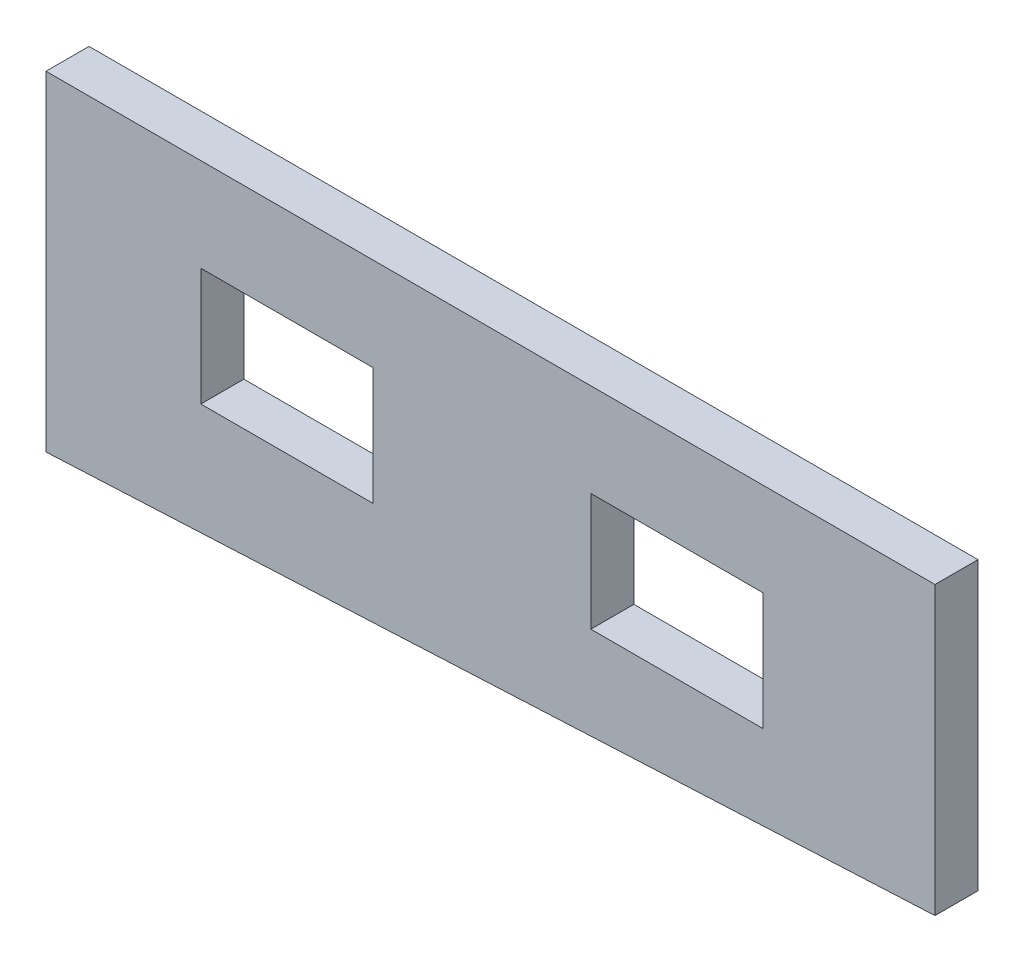
ISO-10303-21;
HEADER;
FILE_DESCRIPTION(('STEP AP214'),'2;1');
FILE_NAME('part.step','',(''),(''),'','','');
FILE_SCHEMA(('AUTOMOTIVE_DESIGN { 1 0 10303 214 1 1 1 1 }'));
ENDSEC;
DATA;
#1=APPLICATION_CONTEXT('core data for automotive mechanical design processes');
#2=APPLICATION_PROTOCOL_DEFINITION('international standard','automotive_design',2000,#1);
#3=PRODUCT_CONTEXT('',#1,'mechanical');
#4=PRODUCT('Part','Part','',(#3));
#5=PRODUCT_RELATED_PRODUCT_CATEGORY('part','',(#4));
#6=PRODUCT_DEFINITION_FORMATION('','',#4);
#7=PRODUCT_DEFINITION_CONTEXT('part definition',#1,'design');
#8=PRODUCT_DEFINITION('design','',#6,#7);
#9=PRODUCT_DEFINITION_SHAPE('','',#8);
#10=(LENGTH_UNIT() NAMED_UNIT(*) SI_UNIT(.MILLI.,.METRE.));
#11=(NAMED_UNIT(*) PLANE_ANGLE_UNIT() SI_UNIT($,.RADIAN.));
#12=(NAMED_UNIT(*) SI_UNIT($,.STERADIAN.) SOLID_ANGLE_UNIT());
#13=UNCERTAINTY_MEASURE_WITH_UNIT(LENGTH_MEASURE(1.E-05),#10,'distance_accuracy_value','');
#14=(GEOMETRIC_REPRESENTATION_CONTEXT(3) GLOBAL_UNCERTAINTY_ASSIGNED_CONTEXT((#13)) GLOBAL_UNIT_ASSIGNED_CONTEXT((#10,
#11,#12)) REPRESENTATION_CONTEXT('',''));
#15=CARTESIAN_POINT('',(0.,0.,0.));
#16=DIRECTION('',(0.,0.,1.));
#17=DIRECTION('',(1.,0.,0.));
#18=AXIS2_PLACEMENT_3D('',#15,#16,#17);
#19=CARTESIAN_POINT('',(6200.,300.,300.));
#20=DIRECTION('',(-0.0483305514233226,0.998831396082,0.));
#21=DIRECTION('',(-0.998831396082,-0.0483305514233226,0.));
#22=AXIS2_PLACEMENT_3D('',#19,#20,#21);
#23=PLANE('',#22);
#24=DIRECTION('',(0.998831396082,0.0483305514233226,0.));
#25=VECTOR('',#24,1.);
#26=CARTESIAN_POINT('',(6200.,300.,0.));
#27=LINE('',#26,#25);
#28=CARTESIAN_POINT('',(0.,0.,0.));
#29=VERTEX_POINT('',#28);
#30=CARTESIAN_POINT('',(6200.,300.,0.));
#31=VERTEX_POINT('',#30);
#32=EDGE_CURVE('E276',#29,#31,#27,.T.);
#33=ORIENTED_EDGE('',*,*,#32,.T.);
#34=DIRECTION('',(0.,0.,-1.));
#35=VECTOR('',#34,1.);
#36=CARTESIAN_POINT('',(6200.,300.,300.));
#37=LINE('',#36,#35);
#38=CARTESIAN_POINT('',(6200.,300.,300.));
#39=VERTEX_POINT('',#38);
#40=EDGE_CURVE('E12',#39,#31,#37,.T.);
#41=ORIENTED_EDGE('',*,*,#40,.F.);
#42=DIRECTION('',(0.998831396082,0.0483305514233226,0.));
#43=VECTOR('',#42,1.);
#44=CARTESIAN_POINT('',(6200.,300.,300.));
#45=LINE('',#44,#43);
#46=CARTESIAN_POINT('',(0.,0.,300.));
#47=VERTEX_POINT('',#46);
#48=EDGE_CURVE('E287',#47,#39,#45,.T.);
#49=ORIENTED_EDGE('',*,*,#48,.F.);
#50=DIRECTION('',(0.,0.,-1.));
#51=VECTOR('',#50,1.);
#52=CARTESIAN_POINT('',(0.,0.,300.));
#53=LINE('',#52,#51);
#54=EDGE_CURVE('E305',#47,#29,#53,.T.);
#55=ORIENTED_EDGE('',*,*,#54,.T.);
#56=EDGE_LOOP('',(#33,#41,#49,#55));
#57=FACE_BOUND('',#56,.T.);
#58=ADVANCED_FACE('F45',(#57),#23,.F.);
#59=CARTESIAN_POINT('',(6200.,2300.,300.));
#60=DIRECTION('',(-1.,0.,0.));
#61=DIRECTION('',(0.,-1.,0.));
#62=AXIS2_PLACEMENT_3D('',#59,#60,#61);
#63=PLANE('',#62);
#64=DIRECTION('',(0.,1.,0.));
#65=VECTOR('',#64,1.);
#66=CARTESIAN_POINT('',(6200.,2300.,0.));
#67=LINE('',#66,#65);
#68=CARTESIAN_POINT('',(6200.,2300.,0.));
#69=VERTEX_POINT('',#68);
#70=EDGE_CURVE('E329',#31,#69,#67,.T.);
#71=ORIENTED_EDGE('',*,*,#70,.T.);
#72=DIRECTION('',(0.,0.,-1.));
#73=VECTOR('',#72,1.);
#74=CARTESIAN_POINT('',(6200.,2300.,300.));
#75=LINE('',#74,#73);
#76=CARTESIAN_POINT('',(6200.,2300.,300.));
#77=VERTEX_POINT('',#76);
#78=EDGE_CURVE('E55',#77,#69,#75,.T.);
#79=ORIENTED_EDGE('',*,*,#78,.F.);
#80=DIRECTION('',(0.,1.,0.));
#81=VECTOR('',#80,1.);
#82=CARTESIAN_POINT('',(6200.,2300.,300.));
#83=LINE('',#82,#81);
#84=EDGE_CURVE('E292',#39,#77,#83,.T.);
#85=ORIENTED_EDGE('',*,*,#84,.F.);
#86=ORIENTED_EDGE('',*,*,#40,.T.);
#87=EDGE_LOOP('',(#71,#79,#85,#86));
#88=FACE_BOUND('',#87,.T.);
#89=ADVANCED_FACE('F355',(#88),#63,.F.);
#90=CARTESIAN_POINT('',(0.,2300.,300.));
#91=DIRECTION('',(0.,-1.,0.));
#92=DIRECTION('',(0.,0.,-1.));
#93=AXIS2_PLACEMENT_3D('',#90,#91,#92);
#94=PLANE('',#93);
#95=DIRECTION('',(-1.,0.,0.));
#96=VECTOR('',#95,1.);
#97=CARTESIAN_POINT('',(0.,2300.,0.));
#98=LINE('',#97,#96);
#99=CARTESIAN_POINT('',(0.,2300.,0.));
#100=VERTEX_POINT('',#99);
#101=EDGE_CURVE('E332',#69,#100,#98,.T.);
#102=ORIENTED_EDGE('',*,*,#101,.T.);
#103=DIRECTION('',(0.,0.,-1.));
#104=VECTOR('',#103,1.);
#105=CARTESIAN_POINT('',(0.,2300.,300.));
#106=LINE('',#105,#104);
#107=CARTESIAN_POINT('',(0.,2300.,300.));
#108=VERTEX_POINT('',#107);
#109=EDGE_CURVE('E310',#108,#100,#106,.T.);
#110=ORIENTED_EDGE('',*,*,#109,.F.);
#111=DIRECTION('',(-1.,0.,0.));
#112=VECTOR('',#111,1.);
#113=CARTESIAN_POINT('',(0.,2300.,300.));
#114=LINE('',#113,#112);
#115=EDGE_CURVE('E319',#77,#108,#114,.T.);
#116=ORIENTED_EDGE('',*,*,#115,.F.);
#117=ORIENTED_EDGE('',*,*,#78,.T.);
#118=EDGE_LOOP('',(#102,#110,#116,#117));
#119=FACE_BOUND('',#118,.T.);
#120=ADVANCED_FACE('F360',(#119),#94,.F.);
#121=CARTESIAN_POINT('',(0.,0.,300.));
#122=DIRECTION('',(1.,0.,0.));
#123=DIRECTION('',(0.,0.,-1.));
#124=AXIS2_PLACEMENT_3D('',#121,#122,#123);
#125=PLANE('',#124);
#126=DIRECTION('',(0.,-1.,0.));
#127=VECTOR('',#126,1.);
#128=CARTESIAN_POINT('',(0.,0.,0.));
#129=LINE('',#128,#127);
#130=EDGE_CURVE('E293',#100,#29,#129,.T.);
#131=ORIENTED_EDGE('',*,*,#130,.T.);
#132=ORIENTED_EDGE('',*,*,#54,.F.);
#133=DIRECTION('',(0.,-1.,0.));
#134=VECTOR('',#133,1.);
#135=CARTESIAN_POINT('',(0.,0.,300.));
#136=LINE('',#135,#134);
#137=EDGE_CURVE('E311',#108,#47,#136,.T.);
#138=ORIENTED_EDGE('',*,*,#137,.F.);
#139=ORIENTED_EDGE('',*,*,#109,.T.);
#140=EDGE_LOOP('',(#131,#132,#138,#139));
#141=FACE_BOUND('',#140,.T.);
#142=ADVANCED_FACE('F346',(#141),#125,.F.);
#143=CARTESIAN_POINT('',(0.,0.,300.));
#144=DIRECTION('',(0.,0.,-1.));
#145=DIRECTION('',(-1.,0.,0.));
#146=AXIS2_PLACEMENT_3D('',#143,#144,#145);
#147=PLANE('',#146);
#148=DIRECTION('',(1.,0.,0.));
#149=VECTOR('',#148,1.);
#150=CARTESIAN_POINT('',(3800.,830.,300.));
#151=LINE('',#150,#149);
#152=CARTESIAN_POINT('',(3800.,830.,300.));
#153=VERTEX_POINT('',#152);
#154=CARTESIAN_POINT('',(5000.,830.,300.));
#155=VERTEX_POINT('',#154);
#156=EDGE_CURVE('E208',#153,#155,#151,.T.);
#157=ORIENTED_EDGE('',*,*,#156,.F.);
#158=DIRECTION('',(0.,-1.,0.));
#159=VECTOR('',#158,1.);
#160=CARTESIAN_POINT('',(3800.,1650.,300.));
#161=LINE('',#160,#159);
#162=CARTESIAN_POINT('',(3800.,1650.,300.));
#163=VERTEX_POINT('',#162);
#164=EDGE_CURVE('E65',#163,#153,#161,.T.);
#165=ORIENTED_EDGE('',*,*,#164,.F.);
#166=DIRECTION('',(-1.,0.,0.));
#167=VECTOR('',#166,1.);
#168=CARTESIAN_POINT('',(3800.,1650.,300.));
#169=LINE('',#168,#167);
#170=CARTESIAN_POINT('',(5000.,1650.,300.));
#171=VERTEX_POINT('',#170);
#172=EDGE_CURVE('E181',#171,#163,#169,.T.);
#173=ORIENTED_EDGE('',*,*,#172,.F.);
#174=DIRECTION('',(0.,1.,0.));
#175=VECTOR('',#174,1.);
#176=CARTESIAN_POINT('',(5000.,1650.,300.));
#177=LINE('',#176,#175);
#178=EDGE_CURVE('E186',#155,#171,#177,.T.);
#179=ORIENTED_EDGE('',*,*,#178,.F.);
#180=EDGE_LOOP('',(#157,#165,#173,#179));
#181=FACE_BOUND('',#180,.T.);
#182=DIRECTION('',(1.,0.,0.));
#183=VECTOR('',#182,1.);
#184=CARTESIAN_POINT('',(1080.,830.,300.));
#185=LINE('',#184,#183);
#186=CARTESIAN_POINT('',(1080.,830.,300.));
#187=VERTEX_POINT('',#186);
#188=CARTESIAN_POINT('',(2280.,830.,300.));
#189=VERTEX_POINT('',#188);
#190=EDGE_CURVE('E262',#187,#189,#185,.T.);
#191=ORIENTED_EDGE('',*,*,#190,.F.);
#192=DIRECTION('',(0.,-1.,0.));
#193=VECTOR('',#192,1.);
#194=CARTESIAN_POINT('',(1080.,1650.,300.));
#195=LINE('',#194,#193);
#196=CARTESIAN_POINT('',(1080.,1650.,300.));
#197=VERTEX_POINT('',#196);
#198=EDGE_CURVE('E224',#197,#187,#195,.T.);
#199=ORIENTED_EDGE('',*,*,#198,.F.);
#200=DIRECTION('',(-1.,0.,0.));
#201=VECTOR('',#200,1.);
#202=CARTESIAN_POINT('',(1080.,1650.,300.));
#203=LINE('',#202,#201);
#204=CARTESIAN_POINT('',(2280.,1650.,300.));
#205=VERTEX_POINT('',#204);
#206=EDGE_CURVE('E241',#205,#197,#203,.T.);
#207=ORIENTED_EDGE('',*,*,#206,.F.);
#208=DIRECTION('',(0.,1.,0.));
#209=VECTOR('',#208,1.);
#210=CARTESIAN_POINT('',(2280.,1650.,300.));
#211=LINE('',#210,#209);
#212=EDGE_CURVE('E270',#189,#205,#211,.T.);
#213=ORIENTED_EDGE('',*,*,#212,.F.);
#214=EDGE_LOOP('',(#191,#199,#207,#213));
#215=FACE_BOUND('',#214,.T.);
#216=ORIENTED_EDGE('',*,*,#48,.T.);
#217=ORIENTED_EDGE('',*,*,#84,.T.);
#218=ORIENTED_EDGE('',*,*,#115,.T.);
#219=ORIENTED_EDGE('',*,*,#137,.T.);
#220=EDGE_LOOP('',(#216,#217,#218,#219));
#221=FACE_BOUND('',#220,.T.);
#222=ADVANCED_FACE('F359',(#181,#215,#221),#147,.F.);
#223=CARTESIAN_POINT('',(0.,0.,0.));
#224=DIRECTION('',(0.,0.,-1.));
#225=DIRECTION('',(-1.,0.,0.));
#226=AXIS2_PLACEMENT_3D('',#223,#224,#225);
#227=PLANE('',#226);
#228=DIRECTION('',(0.,-1.,0.));
#229=VECTOR('',#228,1.);
#230=CARTESIAN_POINT('',(3800.,1650.,0.));
#231=LINE('',#230,#229);
#232=CARTESIAN_POINT('',(3800.,1650.,0.));
#233=VERTEX_POINT('',#232);
#234=CARTESIAN_POINT('',(3800.,830.,0.));
#235=VERTEX_POINT('',#234);
#236=EDGE_CURVE('E162',#233,#235,#231,.T.);
#237=ORIENTED_EDGE('',*,*,#236,.T.);
#238=DIRECTION('',(1.,0.,0.));
#239=VECTOR('',#238,1.);
#240=CARTESIAN_POINT('',(3800.,830.,0.));
#241=LINE('',#240,#239);
#242=CARTESIAN_POINT('',(5000.,830.,0.));
#243=VERTEX_POINT('',#242);
#244=EDGE_CURVE('E172',#235,#243,#241,.T.);
#245=ORIENTED_EDGE('',*,*,#244,.T.);
#246=DIRECTION('',(0.,1.,0.));
#247=VECTOR('',#246,1.);
#248=CARTESIAN_POINT('',(5000.,1650.,0.));
#249=LINE('',#248,#247);
#250=CARTESIAN_POINT('',(5000.,1650.,0.));
#251=VERTEX_POINT('',#250);
#252=EDGE_CURVE('E76',#243,#251,#249,.T.);
#253=ORIENTED_EDGE('',*,*,#252,.T.);
#254=DIRECTION('',(-1.,0.,0.));
#255=VECTOR('',#254,1.);
#256=CARTESIAN_POINT('',(3800.,1650.,0.));
#257=LINE('',#256,#255);
#258=EDGE_CURVE('E169',#251,#233,#257,.T.);
#259=ORIENTED_EDGE('',*,*,#258,.T.);
#260=EDGE_LOOP('',(#237,#245,#253,#259));
#261=FACE_BOUND('',#260,.T.);
#262=DIRECTION('',(0.,-1.,0.));
#263=VECTOR('',#262,1.);
#264=CARTESIAN_POINT('',(1080.,1650.,0.));
#265=LINE('',#264,#263);
#266=CARTESIAN_POINT('',(1080.,1650.,0.));
#267=VERTEX_POINT('',#266);
#268=CARTESIAN_POINT('',(1080.,830.,0.));
#269=VERTEX_POINT('',#268);
#270=EDGE_CURVE('E235',#267,#269,#265,.T.);
#271=ORIENTED_EDGE('',*,*,#270,.T.);
#272=DIRECTION('',(1.,0.,0.));
#273=VECTOR('',#272,1.);
#274=CARTESIAN_POINT('',(1080.,830.,0.));
#275=LINE('',#274,#273);
#276=CARTESIAN_POINT('',(2280.,830.,0.));
#277=VERTEX_POINT('',#276);
#278=EDGE_CURVE('E240',#269,#277,#275,.T.);
#279=ORIENTED_EDGE('',*,*,#278,.T.);
#280=DIRECTION('',(0.,1.,0.));
#281=VECTOR('',#280,1.);
#282=CARTESIAN_POINT('',(2280.,1650.,0.));
#283=LINE('',#282,#281);
#284=CARTESIAN_POINT('',(2280.,1650.,0.));
#285=VERTEX_POINT('',#284);
#286=EDGE_CURVE('E249',#277,#285,#283,.T.);
#287=ORIENTED_EDGE('',*,*,#286,.T.);
#288=DIRECTION('',(-1.,0.,0.));
#289=VECTOR('',#288,1.);
#290=CARTESIAN_POINT('',(1080.,1650.,0.));
#291=LINE('',#290,#289);
#292=EDGE_CURVE('E253',#285,#267,#291,.T.);
#293=ORIENTED_EDGE('',*,*,#292,.T.);
#294=EDGE_LOOP('',(#271,#279,#287,#293));
#295=FACE_BOUND('',#294,.T.);
#296=ORIENTED_EDGE('',*,*,#32,.F.);
#297=ORIENTED_EDGE('',*,*,#130,.F.);
#298=ORIENTED_EDGE('',*,*,#101,.F.);
#299=ORIENTED_EDGE('',*,*,#70,.F.);
#300=EDGE_LOOP('',(#296,#297,#298,#299));
#301=FACE_BOUND('',#300,.T.);
#302=ADVANCED_FACE('F177',(#261,#295,#301),#227,.T.);
#303=CARTESIAN_POINT('',(1080.,1650.,0.));
#304=DIRECTION('',(-1.,0.,0.));
#305=DIRECTION('',(0.,-1.,0.));
#306=AXIS2_PLACEMENT_3D('',#303,#304,#305);
#307=PLANE('',#306);
#308=ORIENTED_EDGE('',*,*,#198,.T.);
#309=DIRECTION('',(0.,0.,1.));
#310=VECTOR('',#309,1.);
#311=CARTESIAN_POINT('',(1080.,830.,0.));
#312=LINE('',#311,#310);
#313=EDGE_CURVE('E258',#269,#187,#312,.T.);
#314=ORIENTED_EDGE('',*,*,#313,.F.);
#315=ORIENTED_EDGE('',*,*,#270,.F.);
#316=DIRECTION('',(0.,0.,1.));
#317=VECTOR('',#316,1.);
#318=CARTESIAN_POINT('',(1080.,1650.,0.));
#319=LINE('',#318,#317);
#320=EDGE_CURVE('E272',#267,#197,#319,.T.);
#321=ORIENTED_EDGE('',*,*,#320,.T.);
#322=EDGE_LOOP('',(#308,#314,#315,#321));
#323=FACE_BOUND('',#322,.T.);
#324=ADVANCED_FACE('F398',(#323),#307,.F.);
#325=CARTESIAN_POINT('',(1080.,1650.,0.));
#326=DIRECTION('',(0.,1.,0.));
#327=DIRECTION('',(0.,0.,1.));
#328=AXIS2_PLACEMENT_3D('',#325,#326,#327);
#329=PLANE('',#328);
#330=ORIENTED_EDGE('',*,*,#206,.T.);
#331=ORIENTED_EDGE('',*,*,#320,.F.);
#332=ORIENTED_EDGE('',*,*,#292,.F.);
#333=DIRECTION('',(0.,0.,1.));
#334=VECTOR('',#333,1.);
#335=CARTESIAN_POINT('',(2280.,1650.,0.));
#336=LINE('',#335,#334);
#337=EDGE_CURVE('E277',#285,#205,#336,.T.);
#338=ORIENTED_EDGE('',*,*,#337,.T.);
#339=EDGE_LOOP('',(#330,#331,#332,#338));
#340=FACE_BOUND('',#339,.T.);
#341=ADVANCED_FACE('F406',(#340),#329,.F.);
#342=CARTESIAN_POINT('',(2280.,1650.,0.));
#343=DIRECTION('',(1.,0.,0.));
#344=DIRECTION('',(0.,1.,0.));
#345=AXIS2_PLACEMENT_3D('',#342,#343,#344);
#346=PLANE('',#345);
#347=ORIENTED_EDGE('',*,*,#212,.T.);
#348=ORIENTED_EDGE('',*,*,#337,.F.);
#349=ORIENTED_EDGE('',*,*,#286,.F.);
#350=DIRECTION('',(0.,0.,1.));
#351=VECTOR('',#350,1.);
#352=CARTESIAN_POINT('',(2280.,830.,0.));
#353=LINE('',#352,#351);
#354=EDGE_CURVE('E285',#277,#189,#353,.T.);
#355=ORIENTED_EDGE('',*,*,#354,.T.);
#356=EDGE_LOOP('',(#347,#348,#349,#355));
#357=FACE_BOUND('',#356,.T.);
#358=ADVANCED_FACE('F415',(#357),#346,.F.);
#359=CARTESIAN_POINT('',(1080.,830.,0.));
#360=DIRECTION('',(0.,-1.,0.));
#361=DIRECTION('',(0.,0.,-1.));
#362=AXIS2_PLACEMENT_3D('',#359,#360,#361);
#363=PLANE('',#362);
#364=ORIENTED_EDGE('',*,*,#190,.T.);
#365=ORIENTED_EDGE('',*,*,#354,.F.);
#366=ORIENTED_EDGE('',*,*,#278,.F.);
#367=ORIENTED_EDGE('',*,*,#313,.T.);
#368=EDGE_LOOP('',(#364,#365,#366,#367));
#369=FACE_BOUND('',#368,.T.);
#370=ADVANCED_FACE('F424',(#369),#363,.F.);
#371=CARTESIAN_POINT('',(3800.,1650.,0.));
#372=DIRECTION('',(-1.,0.,0.));
#373=DIRECTION('',(0.,0.,1.));
#374=AXIS2_PLACEMENT_3D('',#371,#372,#373);
#375=PLANE('',#374);
#376=ORIENTED_EDGE('',*,*,#164,.T.);
#377=DIRECTION('',(0.,0.,1.));
#378=VECTOR('',#377,1.);
#379=CARTESIAN_POINT('',(3800.,830.,0.));
#380=LINE('',#379,#378);
#381=EDGE_CURVE('E158',#235,#153,#380,.T.);
#382=ORIENTED_EDGE('',*,*,#381,.F.);
#383=ORIENTED_EDGE('',*,*,#236,.F.);
#384=DIRECTION('',(0.,0.,1.));
#385=VECTOR('',#384,1.);
#386=CARTESIAN_POINT('',(3800.,1650.,0.));
#387=LINE('',#386,#385);
#388=EDGE_CURVE('E220',#233,#163,#387,.T.);
#389=ORIENTED_EDGE('',*,*,#388,.T.);
#390=EDGE_LOOP('',(#376,#382,#383,#389));
#391=FACE_BOUND('',#390,.T.);
#392=ADVANCED_FACE('F160',(#391),#375,.F.);
#393=CARTESIAN_POINT('',(3800.,1650.,0.));
#394=DIRECTION('',(0.,1.,0.));
#395=DIRECTION('',(0.,0.,1.));
#396=AXIS2_PLACEMENT_3D('',#393,#394,#395);
#397=PLANE('',#396);
#398=ORIENTED_EDGE('',*,*,#172,.T.);
#399=ORIENTED_EDGE('',*,*,#388,.F.);
#400=ORIENTED_EDGE('',*,*,#258,.F.);
#401=DIRECTION('',(0.,0.,1.));
#402=VECTOR('',#401,1.);
#403=CARTESIAN_POINT('',(5000.,1650.,0.));
#404=LINE('',#403,#402);
#405=EDGE_CURVE('E225',#251,#171,#404,.T.);
#406=ORIENTED_EDGE('',*,*,#405,.T.);
#407=EDGE_LOOP('',(#398,#399,#400,#406));
#408=FACE_BOUND('',#407,.T.);
#409=ADVANCED_FACE('F441',(#408),#397,.F.);
#410=CARTESIAN_POINT('',(5000.,1650.,0.));
#411=DIRECTION('',(1.,0.,0.));
#412=DIRECTION('',(0.,1.,0.));
#413=AXIS2_PLACEMENT_3D('',#410,#411,#412);
#414=PLANE('',#413);
#415=ORIENTED_EDGE('',*,*,#178,.T.);
#416=ORIENTED_EDGE('',*,*,#405,.F.);
#417=ORIENTED_EDGE('',*,*,#252,.F.);
#418=DIRECTION('',(0.,0.,1.));
#419=VECTOR('',#418,1.);
#420=CARTESIAN_POINT('',(5000.,830.,0.));
#421=LINE('',#420,#419);
#422=EDGE_CURVE('E168',#243,#155,#421,.T.);
#423=ORIENTED_EDGE('',*,*,#422,.T.);
#424=EDGE_LOOP('',(#415,#416,#417,#423));
#425=FACE_BOUND('',#424,.T.);
#426=ADVANCED_FACE('F449',(#425),#414,.F.);
#427=CARTESIAN_POINT('',(3800.,830.,0.));
#428=DIRECTION('',(0.,-1.,0.));
#429=DIRECTION('',(0.,0.,-1.));
#430=AXIS2_PLACEMENT_3D('',#427,#428,#429);
#431=PLANE('',#430);
#432=ORIENTED_EDGE('',*,*,#156,.T.);
#433=ORIENTED_EDGE('',*,*,#422,.F.);
#434=ORIENTED_EDGE('',*,*,#244,.F.);
#435=ORIENTED_EDGE('',*,*,#381,.T.);
#436=EDGE_LOOP('',(#432,#433,#434,#435));
#437=FACE_BOUND('',#436,.T.);
#438=ADVANCED_FACE('F173',(#437),#431,.F.);
#439=CLOSED_SHELL('',(#58,#89,#120,#142,#222,#302,#324,#341,#358,#370,#392,#409,#426,#438));
#440=MANIFOLD_SOLID_BREP('B2',#439);
#441=ADVANCED_BREP_SHAPE_REPRESENTATION('',(#18,#440),#14);
#442=SHAPE_DEFINITION_REPRESENTATION(#9,#441);
ENDSEC;
END-ISO-10303-21;
